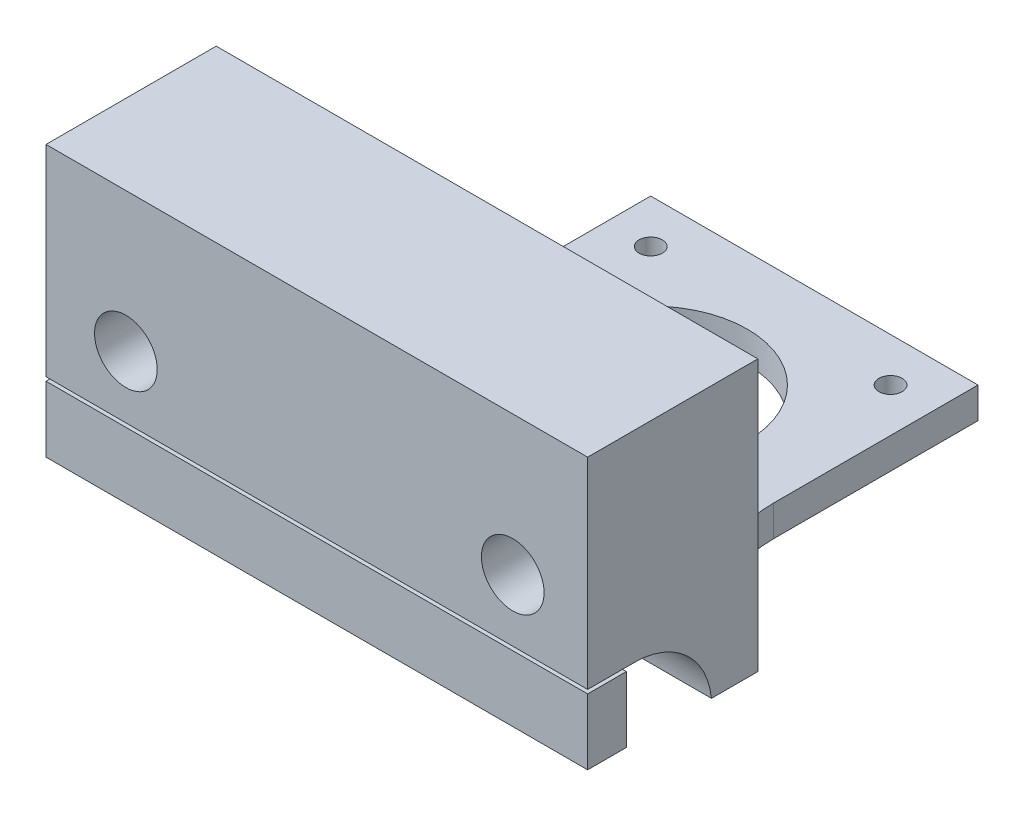
ISO-10303-21;
HEADER;
FILE_DESCRIPTION(('STEP AP214'),'2;1');
FILE_NAME('part.step','',(''),(''),'','','');
FILE_SCHEMA(('AUTOMOTIVE_DESIGN { 1 0 10303 214 1 1 1 1 }'));
ENDSEC;
DATA;
#1=APPLICATION_CONTEXT('core data for automotive mechanical design processes');
#2=APPLICATION_PROTOCOL_DEFINITION('international standard','automotive_design',2000,#1);
#3=PRODUCT_CONTEXT('',#1,'mechanical');
#4=PRODUCT('Part','Part','',(#3));
#5=PRODUCT_RELATED_PRODUCT_CATEGORY('part','',(#4));
#6=PRODUCT_DEFINITION_FORMATION('','',#4);
#7=PRODUCT_DEFINITION_CONTEXT('part definition',#1,'design');
#8=PRODUCT_DEFINITION('design','',#6,#7);
#9=PRODUCT_DEFINITION_SHAPE('','',#8);
#10=(LENGTH_UNIT() NAMED_UNIT(*) SI_UNIT(.MILLI.,.METRE.));
#11=(NAMED_UNIT(*) PLANE_ANGLE_UNIT() SI_UNIT($,.RADIAN.));
#12=(NAMED_UNIT(*) SI_UNIT($,.STERADIAN.) SOLID_ANGLE_UNIT());
#13=UNCERTAINTY_MEASURE_WITH_UNIT(LENGTH_MEASURE(1.E-05),#10,'distance_accuracy_value','');
#14=(GEOMETRIC_REPRESENTATION_CONTEXT(3) GLOBAL_UNCERTAINTY_ASSIGNED_CONTEXT((#13)) GLOBAL_UNIT_ASSIGNED_CONTEXT((#10,
#11,#12)) REPRESENTATION_CONTEXT('',''));
#15=CARTESIAN_POINT('',(0.,0.,0.));
#16=DIRECTION('',(0.,0.,1.));
#17=DIRECTION('',(1.,0.,0.));
#18=AXIS2_PLACEMENT_3D('',#15,#16,#17);
#19=CARTESIAN_POINT('',(-35.,8.5,43.15));
#20=DIRECTION('',(0.,1.,0.));
#21=DIRECTION('',(0.,0.,1.));
#22=AXIS2_PLACEMENT_3D('',#19,#20,#21);
#23=PLANE('',#22);
#24=DIRECTION('',(0.,0.,-1.));
#25=VECTOR('',#24,1.);
#26=CARTESIAN_POINT('',(-35.,8.50000000000001,43.15));
#27=LINE('',#26,#25);
#28=CARTESIAN_POINT('',(-35.,8.50000000000001,43.15));
#29=VERTEX_POINT('',#28);
#30=CARTESIAN_POINT('',(-35.,8.50000000000001,38.15));
#31=VERTEX_POINT('',#30);
#32=EDGE_CURVE('E130',#29,#31,#27,.T.);
#33=ORIENTED_EDGE('',*,*,#32,.F.);
#34=DIRECTION('',(-1.,0.,0.));
#35=VECTOR('',#34,1.);
#36=CARTESIAN_POINT('',(-35.,8.50000000000001,43.15));
#37=LINE('',#36,#35);
#38=CARTESIAN_POINT('',(35.,8.50000000000001,43.15));
#39=VERTEX_POINT('',#38);
#40=EDGE_CURVE('E153',#39,#29,#37,.T.);
#41=ORIENTED_EDGE('',*,*,#40,.F.);
#42=DIRECTION('',(0.,0.,1.));
#43=VECTOR('',#42,1.);
#44=CARTESIAN_POINT('',(35.,8.50000000000001,43.15));
#45=LINE('',#44,#43);
#46=CARTESIAN_POINT('',(35.,8.50000000000001,38.15));
#47=VERTEX_POINT('',#46);
#48=EDGE_CURVE('E158',#47,#39,#45,.T.);
#49=ORIENTED_EDGE('',*,*,#48,.F.);
#50=DIRECTION('',(1.,0.,0.));
#51=VECTOR('',#50,1.);
#52=CARTESIAN_POINT('',(-35.,8.50000000000001,38.15));
#53=LINE('',#52,#51);
#54=EDGE_CURVE('E173',#31,#47,#53,.T.);
#55=ORIENTED_EDGE('',*,*,#54,.F.);
#56=EDGE_LOOP('',(#33,#41,#49,#55));
#57=FACE_BOUND('',#56,.T.);
#58=ADVANCED_FACE('F122',(#57),#23,.T.);
#59=CARTESIAN_POINT('',(0.,0.,0.));
#60=DIRECTION('',(0.,-1.,0.));
#61=DIRECTION('',(0.,0.,-1.));
#62=AXIS2_PLACEMENT_3D('',#59,#60,#61);
#63=PLANE('',#62);
#64=DIRECTION('',(0.,0.,-1.));
#65=VECTOR('',#64,1.);
#66=CARTESIAN_POINT('',(-35.,0.,43.15));
#67=LINE('',#66,#65);
#68=CARTESIAN_POINT('',(-35.,0.,43.15));
#69=VERTEX_POINT('',#68);
#70=CARTESIAN_POINT('',(-35.,0.,38.15));
#71=VERTEX_POINT('',#70);
#72=EDGE_CURVE('E182',#69,#71,#67,.T.);
#73=ORIENTED_EDGE('',*,*,#72,.T.);
#74=DIRECTION('',(1.,0.,0.));
#75=VECTOR('',#74,1.);
#76=CARTESIAN_POINT('',(-35.,0.,38.15));
#77=LINE('',#76,#75);
#78=CARTESIAN_POINT('',(35.,0.,38.15));
#79=VERTEX_POINT('',#78);
#80=EDGE_CURVE('E171',#71,#79,#77,.T.);
#81=ORIENTED_EDGE('',*,*,#80,.T.);
#82=DIRECTION('',(0.,0.,1.));
#83=VECTOR('',#82,1.);
#84=CARTESIAN_POINT('',(35.,0.,43.15));
#85=LINE('',#84,#83);
#86=CARTESIAN_POINT('',(35.,0.,43.15));
#87=VERTEX_POINT('',#86);
#88=EDGE_CURVE('E174',#79,#87,#85,.T.);
#89=ORIENTED_EDGE('',*,*,#88,.T.);
#90=DIRECTION('',(-1.,0.,0.));
#91=VECTOR('',#90,1.);
#92=CARTESIAN_POINT('',(-35.,0.,43.15));
#93=LINE('',#92,#91);
#94=EDGE_CURVE('E179',#87,#69,#93,.T.);
#95=ORIENTED_EDGE('',*,*,#94,.T.);
#96=EDGE_LOOP('',(#73,#81,#89,#95));
#97=FACE_BOUND('',#96,.T.);
#98=ADVANCED_FACE('F181',(#97),#63,.T.);
#99=CARTESIAN_POINT('',(-35.,79.178344238091,38.15));
#100=DIRECTION('',(0.,0.,-1.));
#101=DIRECTION('',(-1.,0.,0.));
#102=AXIS2_PLACEMENT_3D('',#99,#100,#101);
#103=PLANE('',#102);
#104=DIRECTION('',(0.,-1.,0.));
#105=VECTOR('',#104,1.);
#106=CARTESIAN_POINT('',(-35.,79.178344238091,38.15));
#107=LINE('',#106,#105);
#108=EDGE_CURVE('E14',#31,#71,#107,.T.);
#109=ORIENTED_EDGE('',*,*,#108,.F.);
#110=ORIENTED_EDGE('',*,*,#54,.T.);
#111=DIRECTION('',(0.,-1.,0.));
#112=VECTOR('',#111,1.);
#113=CARTESIAN_POINT('',(35.,79.178344238091,38.15));
#114=LINE('',#113,#112);
#115=EDGE_CURVE('E168',#47,#79,#114,.T.);
#116=ORIENTED_EDGE('',*,*,#115,.T.);
#117=ORIENTED_EDGE('',*,*,#80,.F.);
#118=EDGE_LOOP('',(#109,#110,#116,#117));
#119=FACE_BOUND('',#118,.T.);
#120=ADVANCED_FACE('F169',(#119),#103,.T.);
#121=CARTESIAN_POINT('',(35.,79.178344238091,43.15));
#122=DIRECTION('',(1.,0.,0.));
#123=DIRECTION('',(0.,0.,-1.));
#124=AXIS2_PLACEMENT_3D('',#121,#122,#123);
#125=PLANE('',#124);
#126=ORIENTED_EDGE('',*,*,#115,.F.);
#127=ORIENTED_EDGE('',*,*,#48,.T.);
#128=DIRECTION('',(0.,-1.,0.));
#129=VECTOR('',#128,1.);
#130=CARTESIAN_POINT('',(35.,79.178344238091,43.15));
#131=LINE('',#130,#129);
#132=EDGE_CURVE('E163',#39,#87,#131,.T.);
#133=ORIENTED_EDGE('',*,*,#132,.T.);
#134=ORIENTED_EDGE('',*,*,#88,.F.);
#135=EDGE_LOOP('',(#126,#127,#133,#134));
#136=FACE_BOUND('',#135,.T.);
#137=ADVANCED_FACE('F175',(#136),#125,.T.);
#138=CARTESIAN_POINT('',(-35.,79.178344238091,43.15));
#139=DIRECTION('',(0.,0.,1.));
#140=DIRECTION('',(1.,0.,0.));
#141=AXIS2_PLACEMENT_3D('',#138,#139,#140);
#142=PLANE('',#141);
#143=ORIENTED_EDGE('',*,*,#132,.F.);
#144=ORIENTED_EDGE('',*,*,#40,.T.);
#145=DIRECTION('',(0.,-1.,0.));
#146=VECTOR('',#145,1.);
#147=CARTESIAN_POINT('',(-35.,79.178344238091,43.15));
#148=LINE('',#147,#146);
#149=EDGE_CURVE('E189',#29,#69,#148,.T.);
#150=ORIENTED_EDGE('',*,*,#149,.T.);
#151=ORIENTED_EDGE('',*,*,#94,.F.);
#152=EDGE_LOOP('',(#143,#144,#150,#151));
#153=FACE_BOUND('',#152,.T.);
#154=ADVANCED_FACE('F195',(#153),#142,.T.);
#155=CARTESIAN_POINT('',(-35.,79.178344238091,43.15));
#156=DIRECTION('',(-1.,0.,0.));
#157=DIRECTION('',(0.,0.,1.));
#158=AXIS2_PLACEMENT_3D('',#155,#156,#157);
#159=PLANE('',#158);
#160=ORIENTED_EDGE('',*,*,#149,.F.);
#161=ORIENTED_EDGE('',*,*,#32,.T.);
#162=ORIENTED_EDGE('',*,*,#108,.T.);
#163=ORIENTED_EDGE('',*,*,#72,.F.);
#164=EDGE_LOOP('',(#160,#161,#162,#163));
#165=FACE_BOUND('',#164,.T.);
#166=ADVANCED_FACE('F196',(#165),#159,.T.);
#167=CLOSED_SHELL('',(#58,#98,#120,#137,#154,#166));
#168=MANIFOLD_SOLID_BREP('B2',#167);
#169=CARTESIAN_POINT('',(0.,4.,0.));
#170=DIRECTION('',(0.,1.,0.));
#171=DIRECTION('',(0.,0.,1.));
#172=AXIS2_PLACEMENT_3D('',#169,#170,#171);
#173=PLANE('',#172);
#174=CARTESIAN_POINT('',(-15.5,4.,15.5));
#175=DIRECTION('',(0.,1.,0.));
#176=DIRECTION('',(0.,0.,1.));
#177=AXIS2_PLACEMENT_3D('',#174,#175,#176);
#178=CIRCLE('',#177,1.5);
#179=CARTESIAN_POINT('',(-15.5,4.,17.));
#180=VERTEX_POINT('',#179);
#181=EDGE_CURVE('E496',#180,#180,#178,.T.);
#182=ORIENTED_EDGE('',*,*,#181,.F.);
#183=EDGE_LOOP('',(#182));
#184=FACE_BOUND('',#183,.T.);
#185=CARTESIAN_POINT('',(-15.5,4.,-15.5));
#186=DIRECTION('',(0.,1.,0.));
#187=DIRECTION('',(0.,0.,1.));
#188=AXIS2_PLACEMENT_3D('',#185,#186,#187);
#189=CIRCLE('',#188,1.5);
#190=CARTESIAN_POINT('',(-15.5,4.,-14.));
#191=VERTEX_POINT('',#190);
#192=EDGE_CURVE('E508',#191,#191,#189,.T.);
#193=ORIENTED_EDGE('',*,*,#192,.F.);
#194=EDGE_LOOP('',(#193));
#195=FACE_BOUND('',#194,.T.);
#196=CARTESIAN_POINT('',(-37.15,4.,5.29511116406048));
#197=DIRECTION('',(0.,1.,0.));
#198=DIRECTION('',(0.,0.,1.));
#199=AXIS2_PLACEMENT_3D('',#196,#197,#198);
#200=CIRCLE('',#199,16.);
#201=CARTESIAN_POINT('',(-21.15,4.,5.29511116406048));
#202=VERTEX_POINT('',#201);
#203=CARTESIAN_POINT('',(-29.1473719726731,4.,19.15));
#204=VERTEX_POINT('',#203);
#205=EDGE_CURVE('E394',#202,#204,#200,.F.);
#206=ORIENTED_EDGE('',*,*,#205,.T.);
#207=DIRECTION('',(1.,0.,0.));
#208=VECTOR('',#207,1.);
#209=CARTESIAN_POINT('',(0.,4.,19.15));
#210=LINE('',#209,#208);
#211=CARTESIAN_POINT('',(29.1473719726731,4.,19.15));
#212=VERTEX_POINT('',#211);
#213=EDGE_CURVE('E402',#204,#212,#210,.T.);
#214=ORIENTED_EDGE('',*,*,#213,.T.);
#215=CARTESIAN_POINT('',(37.15,4.,5.29511116406048));
#216=DIRECTION('',(0.,1.,0.));
#217=DIRECTION('',(0.,0.,1.));
#218=AXIS2_PLACEMENT_3D('',#215,#216,#217);
#219=CIRCLE('',#218,16.);
#220=CARTESIAN_POINT('',(21.15,4.,5.29511116406048));
#221=VERTEX_POINT('',#220);
#222=EDGE_CURVE('E390',#212,#221,#219,.F.);
#223=ORIENTED_EDGE('',*,*,#222,.T.);
#224=DIRECTION('',(0.,0.,1.));
#225=VECTOR('',#224,1.);
#226=CARTESIAN_POINT('',(21.15,4.,-21.15));
#227=LINE('',#226,#225);
#228=CARTESIAN_POINT('',(21.15,4.,-21.15));
#229=VERTEX_POINT('',#228);
#230=EDGE_CURVE('E458',#229,#221,#227,.T.);
#231=ORIENTED_EDGE('',*,*,#230,.F.);
#232=DIRECTION('',(1.,0.,0.));
#233=VECTOR('',#232,1.);
#234=CARTESIAN_POINT('',(-21.15,4.,-21.15));
#235=LINE('',#234,#233);
#236=CARTESIAN_POINT('',(-21.15,4.,-21.15));
#237=VERTEX_POINT('',#236);
#238=EDGE_CURVE('E465',#237,#229,#235,.T.);
#239=ORIENTED_EDGE('',*,*,#238,.F.);
#240=DIRECTION('',(0.,0.,1.));
#241=VECTOR('',#240,1.);
#242=CARTESIAN_POINT('',(-21.15,4.,-21.15));
#243=LINE('',#242,#241);
#244=EDGE_CURVE('E466',#237,#202,#243,.T.);
#245=ORIENTED_EDGE('',*,*,#244,.T.);
#246=EDGE_LOOP('',(#206,#214,#223,#231,#239,#245));
#247=FACE_BOUND('',#246,.T.);
#248=CARTESIAN_POINT('',(0.,4.,0.));
#249=DIRECTION('',(0.,1.,0.));
#250=DIRECTION('',(0.,0.,1.));
#251=AXIS2_PLACEMENT_3D('',#248,#249,#250);
#252=CIRCLE('',#251,12.5);
#253=CARTESIAN_POINT('',(0.,4.,12.5));
#254=VERTEX_POINT('',#253);
#255=EDGE_CURVE('E514',#254,#254,#252,.T.);
#256=ORIENTED_EDGE('',*,*,#255,.F.);
#257=EDGE_LOOP('',(#256));
#258=FACE_BOUND('',#257,.T.);
#259=CARTESIAN_POINT('',(15.5,4.,15.5));
#260=DIRECTION('',(0.,1.,0.));
#261=DIRECTION('',(0.,0.,1.));
#262=AXIS2_PLACEMENT_3D('',#259,#260,#261);
#263=CIRCLE('',#262,1.5);
#264=CARTESIAN_POINT('',(15.5,4.,17.));
#265=VERTEX_POINT('',#264);
#266=EDGE_CURVE('E502',#265,#265,#263,.T.);
#267=ORIENTED_EDGE('',*,*,#266,.F.);
#268=EDGE_LOOP('',(#267));
#269=FACE_BOUND('',#268,.T.);
#270=CARTESIAN_POINT('',(15.5,4.,-15.5));
#271=DIRECTION('',(0.,1.,0.));
#272=DIRECTION('',(0.,0.,1.));
#273=AXIS2_PLACEMENT_3D('',#270,#271,#272);
#274=CIRCLE('',#273,1.5);
#275=CARTESIAN_POINT('',(15.5,4.,-14.));
#276=VERTEX_POINT('',#275);
#277=EDGE_CURVE('E490',#276,#276,#274,.T.);
#278=ORIENTED_EDGE('',*,*,#277,.F.);
#279=EDGE_LOOP('',(#278));
#280=FACE_BOUND('',#279,.T.);
#281=ADVANCED_FACE('F246',(#184,#195,#247,#258,#269,#280),#173,.T.);
#282=CARTESIAN_POINT('',(0.,0.,0.));
#283=DIRECTION('',(0.,1.,0.));
#284=DIRECTION('',(0.,0.,1.));
#285=AXIS2_PLACEMENT_3D('',#282,#283,#284);
#286=PLANE('',#285);
#287=CARTESIAN_POINT('',(-15.5,0.,15.5));
#288=DIRECTION('',(0.,1.,0.));
#289=DIRECTION('',(0.,0.,1.));
#290=AXIS2_PLACEMENT_3D('',#287,#288,#289);
#291=CIRCLE('',#290,1.5);
#292=CARTESIAN_POINT('',(-15.5,0.,17.));
#293=VERTEX_POINT('',#292);
#294=EDGE_CURVE('E493',#293,#293,#291,.T.);
#295=ORIENTED_EDGE('',*,*,#294,.T.);
#296=EDGE_LOOP('',(#295));
#297=FACE_BOUND('',#296,.T.);
#298=CARTESIAN_POINT('',(-15.5,0.,-15.5));
#299=DIRECTION('',(0.,1.,0.));
#300=DIRECTION('',(0.,0.,1.));
#301=AXIS2_PLACEMENT_3D('',#298,#299,#300);
#302=CIRCLE('',#301,1.5);
#303=CARTESIAN_POINT('',(-15.5,0.,-14.));
#304=VERTEX_POINT('',#303);
#305=EDGE_CURVE('E505',#304,#304,#302,.T.);
#306=ORIENTED_EDGE('',*,*,#305,.T.);
#307=EDGE_LOOP('',(#306));
#308=FACE_BOUND('',#307,.T.);
#309=DIRECTION('',(0.,0.,1.));
#310=VECTOR('',#309,1.);
#311=CARTESIAN_POINT('',(-21.15,0.,-21.15));
#312=LINE('',#311,#310);
#313=CARTESIAN_POINT('',(-21.15,0.,-21.15));
#314=VERTEX_POINT('',#313);
#315=CARTESIAN_POINT('',(-21.15,0.,5.29511116406048));
#316=VERTEX_POINT('',#315);
#317=EDGE_CURVE('E517',#314,#316,#312,.T.);
#318=ORIENTED_EDGE('',*,*,#317,.F.);
#319=DIRECTION('',(1.,0.,0.));
#320=VECTOR('',#319,1.);
#321=CARTESIAN_POINT('',(-21.15,0.,-21.15));
#322=LINE('',#321,#320);
#323=CARTESIAN_POINT('',(21.15,0.,-21.15));
#324=VERTEX_POINT('',#323);
#325=EDGE_CURVE('E521',#314,#324,#322,.T.);
#326=ORIENTED_EDGE('',*,*,#325,.T.);
#327=DIRECTION('',(0.,0.,1.));
#328=VECTOR('',#327,1.);
#329=CARTESIAN_POINT('',(21.15,0.,-21.15));
#330=LINE('',#329,#328);
#331=CARTESIAN_POINT('',(21.15,0.,5.29511116406048));
#332=VERTEX_POINT('',#331);
#333=EDGE_CURVE('E477',#324,#332,#330,.T.);
#334=ORIENTED_EDGE('',*,*,#333,.T.);
#335=CARTESIAN_POINT('',(37.15,0.,5.29511116406048));
#336=DIRECTION('',(0.,1.,0.));
#337=DIRECTION('',(0.,0.,1.));
#338=AXIS2_PLACEMENT_3D('',#335,#336,#337);
#339=CIRCLE('',#338,16.);
#340=CARTESIAN_POINT('',(35.,0.,21.15));
#341=VERTEX_POINT('',#340);
#342=EDGE_CURVE('E388',#332,#341,#339,.T.);
#343=ORIENTED_EDGE('',*,*,#342,.T.);
#344=DIRECTION('',(0.,0.,-1.));
#345=VECTOR('',#344,1.);
#346=CARTESIAN_POINT('',(35.,0.,27.15));
#347=LINE('',#346,#345);
#348=CARTESIAN_POINT('',(35.,0.,27.15));
#349=VERTEX_POINT('',#348);
#350=EDGE_CURVE('E474',#349,#341,#347,.T.);
#351=ORIENTED_EDGE('',*,*,#350,.F.);
#352=DIRECTION('',(1.,0.,0.));
#353=VECTOR('',#352,1.);
#354=CARTESIAN_POINT('',(0.,0.,27.15));
#355=LINE('',#354,#353);
#356=CARTESIAN_POINT('',(-35.,0.,27.15));
#357=VERTEX_POINT('',#356);
#358=EDGE_CURVE('E549',#357,#349,#355,.T.);
#359=ORIENTED_EDGE('',*,*,#358,.F.);
#360=DIRECTION('',(0.,0.,-1.));
#361=VECTOR('',#360,1.);
#362=CARTESIAN_POINT('',(-35.,0.,27.15));
#363=LINE('',#362,#361);
#364=CARTESIAN_POINT('',(-35.,0.,21.15));
#365=VERTEX_POINT('',#364);
#366=EDGE_CURVE('E479',#357,#365,#363,.T.);
#367=ORIENTED_EDGE('',*,*,#366,.T.);
#368=CARTESIAN_POINT('',(-37.15,0.,5.29511116406048));
#369=DIRECTION('',(0.,1.,0.));
#370=DIRECTION('',(0.,0.,1.));
#371=AXIS2_PLACEMENT_3D('',#368,#369,#370);
#372=CIRCLE('',#371,16.);
#373=EDGE_CURVE('E392',#365,#316,#372,.T.);
#374=ORIENTED_EDGE('',*,*,#373,.T.);
#375=EDGE_LOOP('',(#318,#326,#334,#343,#351,#359,#367,#374));
#376=FACE_BOUND('',#375,.T.);
#377=CARTESIAN_POINT('',(0.,0.,0.));
#378=DIRECTION('',(0.,1.,0.));
#379=DIRECTION('',(0.,0.,1.));
#380=AXIS2_PLACEMENT_3D('',#377,#378,#379);
#381=CIRCLE('',#380,12.5);
#382=CARTESIAN_POINT('',(0.,0.,12.5));
#383=VERTEX_POINT('',#382);
#384=EDGE_CURVE('E511',#383,#383,#381,.T.);
#385=ORIENTED_EDGE('',*,*,#384,.T.);
#386=EDGE_LOOP('',(#385));
#387=FACE_BOUND('',#386,.T.);
#388=CARTESIAN_POINT('',(15.5,0.,15.5));
#389=DIRECTION('',(0.,1.,0.));
#390=DIRECTION('',(0.,0.,1.));
#391=AXIS2_PLACEMENT_3D('',#388,#389,#390);
#392=CIRCLE('',#391,1.5);
#393=CARTESIAN_POINT('',(15.5,0.,17.));
#394=VERTEX_POINT('',#393);
#395=EDGE_CURVE('E499',#394,#394,#392,.T.);
#396=ORIENTED_EDGE('',*,*,#395,.T.);
#397=EDGE_LOOP('',(#396));
#398=FACE_BOUND('',#397,.T.);
#399=CARTESIAN_POINT('',(15.5,0.,-15.5));
#400=DIRECTION('',(0.,1.,0.));
#401=DIRECTION('',(0.,0.,1.));
#402=AXIS2_PLACEMENT_3D('',#399,#400,#401);
#403=CIRCLE('',#402,1.5);
#404=CARTESIAN_POINT('',(15.5,0.,-14.));
#405=VERTEX_POINT('',#404);
#406=EDGE_CURVE('E483',#405,#405,#403,.T.);
#407=ORIENTED_EDGE('',*,*,#406,.T.);
#408=EDGE_LOOP('',(#407));
#409=FACE_BOUND('',#408,.T.);
#410=ADVANCED_FACE('F432',(#297,#308,#376,#387,#398,#409),#286,.F.);
#411=CARTESIAN_POINT('',(-21.15,4.,-21.15));
#412=DIRECTION('',(1.,0.,0.));
#413=DIRECTION('',(0.,0.,-1.));
#414=AXIS2_PLACEMENT_3D('',#411,#412,#413);
#415=PLANE('',#414);
#416=ORIENTED_EDGE('',*,*,#317,.T.);
#417=DIRECTION('',(0.,-1.,0.));
#418=VECTOR('',#417,1.);
#419=CARTESIAN_POINT('',(-21.15,4.,5.29511116406048));
#420=LINE('',#419,#418);
#421=EDGE_CURVE('E385',#316,#202,#420,.F.);
#422=ORIENTED_EDGE('',*,*,#421,.T.);
#423=ORIENTED_EDGE('',*,*,#244,.F.);
#424=DIRECTION('',(0.,-1.,0.));
#425=VECTOR('',#424,1.);
#426=CARTESIAN_POINT('',(-21.15,4.,-21.15));
#427=LINE('',#426,#425);
#428=EDGE_CURVE('E524',#237,#314,#427,.T.);
#429=ORIENTED_EDGE('',*,*,#428,.T.);
#430=EDGE_LOOP('',(#416,#422,#423,#429));
#431=FACE_BOUND('',#430,.T.);
#432=ADVANCED_FACE('F419',(#431),#415,.F.);
#433=CARTESIAN_POINT('',(21.15,4.,-21.15));
#434=DIRECTION('',(1.,0.,0.));
#435=DIRECTION('',(0.,0.,-1.));
#436=AXIS2_PLACEMENT_3D('',#433,#434,#435);
#437=PLANE('',#436);
#438=ORIENTED_EDGE('',*,*,#230,.T.);
#439=DIRECTION('',(0.,1.,0.));
#440=VECTOR('',#439,1.);
#441=CARTESIAN_POINT('',(21.15,0.,5.29511116406048));
#442=LINE('',#441,#440);
#443=EDGE_CURVE('E382',#221,#332,#442,.F.);
#444=ORIENTED_EDGE('',*,*,#443,.T.);
#445=ORIENTED_EDGE('',*,*,#333,.F.);
#446=DIRECTION('',(0.,-1.,0.));
#447=VECTOR('',#446,1.);
#448=CARTESIAN_POINT('',(21.15,4.,-21.15));
#449=LINE('',#448,#447);
#450=EDGE_CURVE('E386',#229,#324,#449,.T.);
#451=ORIENTED_EDGE('',*,*,#450,.F.);
#452=EDGE_LOOP('',(#438,#444,#445,#451));
#453=FACE_BOUND('',#452,.T.);
#454=ADVANCED_FACE('F448',(#453),#437,.T.);
#455=CARTESIAN_POINT('',(-21.15,4.,-21.15));
#456=DIRECTION('',(0.,0.,-1.));
#457=DIRECTION('',(-1.,0.,0.));
#458=AXIS2_PLACEMENT_3D('',#455,#456,#457);
#459=PLANE('',#458);
#460=ORIENTED_EDGE('',*,*,#325,.F.);
#461=ORIENTED_EDGE('',*,*,#428,.F.);
#462=ORIENTED_EDGE('',*,*,#238,.T.);
#463=ORIENTED_EDGE('',*,*,#450,.T.);
#464=EDGE_LOOP('',(#460,#461,#462,#463));
#465=FACE_BOUND('',#464,.T.);
#466=ADVANCED_FACE('F446',(#465),#459,.T.);
#467=CARTESIAN_POINT('',(0.,4.,0.));
#468=DIRECTION('',(0.,-1.,0.));
#469=DIRECTION('',(0.,0.,-1.));
#470=AXIS2_PLACEMENT_3D('',#467,#468,#469);
#471=CYLINDRICAL_SURFACE('',#470,12.5);
#472=ORIENTED_EDGE('',*,*,#255,.T.);
#473=EDGE_LOOP('',(#472));
#474=FACE_BOUND('',#473,.T.);
#475=ORIENTED_EDGE('',*,*,#384,.F.);
#476=EDGE_LOOP('',(#475));
#477=FACE_BOUND('',#476,.T.);
#478=ADVANCED_FACE('F443',(#474,#477),#471,.F.);
#479=CARTESIAN_POINT('',(-15.5,4.,-15.5));
#480=DIRECTION('',(0.,-1.,0.));
#481=DIRECTION('',(0.,0.,-1.));
#482=AXIS2_PLACEMENT_3D('',#479,#480,#481);
#483=CYLINDRICAL_SURFACE('',#482,1.5);
#484=ORIENTED_EDGE('',*,*,#192,.T.);
#485=EDGE_LOOP('',(#484));
#486=FACE_BOUND('',#485,.T.);
#487=ORIENTED_EDGE('',*,*,#305,.F.);
#488=EDGE_LOOP('',(#487));
#489=FACE_BOUND('',#488,.T.);
#490=ADVANCED_FACE('F595',(#486,#489),#483,.F.);
#491=CARTESIAN_POINT('',(15.5,4.,15.5));
#492=DIRECTION('',(0.,-1.,0.));
#493=DIRECTION('',(0.,0.,-1.));
#494=AXIS2_PLACEMENT_3D('',#491,#492,#493);
#495=CYLINDRICAL_SURFACE('',#494,1.5);
#496=ORIENTED_EDGE('',*,*,#266,.T.);
#497=EDGE_LOOP('',(#496));
#498=FACE_BOUND('',#497,.T.);
#499=ORIENTED_EDGE('',*,*,#395,.F.);
#500=EDGE_LOOP('',(#499));
#501=FACE_BOUND('',#500,.T.);
#502=ADVANCED_FACE('F592',(#498,#501),#495,.F.);
#503=CARTESIAN_POINT('',(-15.5,4.,15.5));
#504=DIRECTION('',(0.,-1.,0.));
#505=DIRECTION('',(0.,0.,-1.));
#506=AXIS2_PLACEMENT_3D('',#503,#504,#505);
#507=CYLINDRICAL_SURFACE('',#506,1.5);
#508=ORIENTED_EDGE('',*,*,#181,.T.);
#509=EDGE_LOOP('',(#508));
#510=FACE_BOUND('',#509,.T.);
#511=ORIENTED_EDGE('',*,*,#294,.F.);
#512=EDGE_LOOP('',(#511));
#513=FACE_BOUND('',#512,.T.);
#514=ADVANCED_FACE('F588',(#510,#513),#507,.F.);
#515=CARTESIAN_POINT('',(15.5,4.,-15.5));
#516=DIRECTION('',(0.,-1.,0.));
#517=DIRECTION('',(0.,0.,-1.));
#518=AXIS2_PLACEMENT_3D('',#515,#516,#517);
#519=CYLINDRICAL_SURFACE('',#518,1.5);
#520=ORIENTED_EDGE('',*,*,#277,.T.);
#521=EDGE_LOOP('',(#520));
#522=FACE_BOUND('',#521,.T.);
#523=ORIENTED_EDGE('',*,*,#406,.F.);
#524=EDGE_LOOP('',(#523));
#525=FACE_BOUND('',#524,.T.);
#526=ADVANCED_FACE('F585',(#522,#525),#519,.F.);
#527=CARTESIAN_POINT('',(-35.,0.,27.15));
#528=DIRECTION('',(-1.,0.,0.));
#529=DIRECTION('',(0.,-1.,0.));
#530=AXIS2_PLACEMENT_3D('',#527,#528,#529);
#531=PLANE('',#530);
#532=DIRECTION('',(0.,1.,0.));
#533=VECTOR('',#532,1.);
#534=CARTESIAN_POINT('',(-35.,0.,21.15));
#535=LINE('',#534,#533);
#536=CARTESIAN_POINT('',(-35.,6.,21.15));
#537=VERTEX_POINT('',#536);
#538=EDGE_CURVE('E367',#365,#537,#535,.T.);
#539=ORIENTED_EDGE('',*,*,#538,.F.);
#540=ORIENTED_EDGE('',*,*,#366,.F.);
#541=CARTESIAN_POINT('',(-35.,-0.999999999999996,37.0998743710662));
#542=DIRECTION('',(-1.,0.,0.));
#543=DIRECTION('',(0.,-1.,0.));
#544=AXIS2_PLACEMENT_3D('',#541,#542,#543);
#545=CIRCLE('',#544,10.);
#546=CARTESIAN_POINT('',(-35.,9.00000000000001,37.0998743710662));
#547=VERTEX_POINT('',#546);
#548=EDGE_CURVE('E364',#357,#547,#545,.F.);
#549=ORIENTED_EDGE('',*,*,#548,.T.);
#550=DIRECTION('',(0.,0.,-1.));
#551=VECTOR('',#550,1.);
#552=CARTESIAN_POINT('',(-35.,9.00000000000001,43.15));
#553=LINE('',#552,#551);
#554=CARTESIAN_POINT('',(-35.,9.00000000000001,43.15));
#555=VERTEX_POINT('',#554);
#556=EDGE_CURVE('E341',#555,#547,#553,.T.);
#557=ORIENTED_EDGE('',*,*,#556,.F.);
#558=DIRECTION('',(0.,-1.,0.));
#559=VECTOR('',#558,1.);
#560=CARTESIAN_POINT('',(-35.,35.,43.15));
#561=LINE('',#560,#559);
#562=CARTESIAN_POINT('',(-35.,35.,43.15));
#563=VERTEX_POINT('',#562);
#564=EDGE_CURVE('E349',#563,#555,#561,.T.);
#565=ORIENTED_EDGE('',*,*,#564,.F.);
#566=DIRECTION('',(0.,0.,-1.));
#567=VECTOR('',#566,1.);
#568=CARTESIAN_POINT('',(-35.,35.,27.15));
#569=LINE('',#568,#567);
#570=CARTESIAN_POINT('',(-35.,35.,21.15));
#571=VERTEX_POINT('',#570);
#572=EDGE_CURVE('E486',#563,#571,#569,.T.);
#573=ORIENTED_EDGE('',*,*,#572,.T.);
#574=EDGE_CURVE('E365',#537,#571,#535,.T.);
#575=ORIENTED_EDGE('',*,*,#574,.F.);
#576=EDGE_LOOP('',(#539,#540,#549,#557,#565,#573,#575));
#577=FACE_BOUND('',#576,.T.);
#578=ADVANCED_FACE('F362',(#577),#531,.T.);
#579=CARTESIAN_POINT('',(35.,0.,27.15));
#580=DIRECTION('',(-1.,0.,0.));
#581=DIRECTION('',(0.,0.,1.));
#582=AXIS2_PLACEMENT_3D('',#579,#580,#581);
#583=PLANE('',#582);
#584=DIRECTION('',(0.,1.,0.));
#585=VECTOR('',#584,1.);
#586=CARTESIAN_POINT('',(35.,0.,21.15));
#587=LINE('',#586,#585);
#588=CARTESIAN_POINT('',(35.,6.,21.15));
#589=VERTEX_POINT('',#588);
#590=EDGE_CURVE('E266',#341,#589,#587,.T.);
#591=ORIENTED_EDGE('',*,*,#590,.T.);
#592=CARTESIAN_POINT('',(35.,35.,21.15));
#593=VERTEX_POINT('',#592);
#594=EDGE_CURVE('E546',#589,#593,#587,.T.);
#595=ORIENTED_EDGE('',*,*,#594,.T.);
#596=DIRECTION('',(0.,0.,-1.));
#597=VECTOR('',#596,1.);
#598=CARTESIAN_POINT('',(35.,35.,27.15));
#599=LINE('',#598,#597);
#600=CARTESIAN_POINT('',(35.,35.,43.15));
#601=VERTEX_POINT('',#600);
#602=EDGE_CURVE('E480',#601,#593,#599,.T.);
#603=ORIENTED_EDGE('',*,*,#602,.F.);
#604=DIRECTION('',(0.,1.,0.));
#605=VECTOR('',#604,1.);
#606=CARTESIAN_POINT('',(35.,35.,43.15));
#607=LINE('',#606,#605);
#608=CARTESIAN_POINT('',(35.,9.00000000000001,43.15));
#609=VERTEX_POINT('',#608);
#610=EDGE_CURVE('E348',#609,#601,#607,.T.);
#611=ORIENTED_EDGE('',*,*,#610,.F.);
#612=DIRECTION('',(0.,0.,-1.));
#613=VECTOR('',#612,1.);
#614=CARTESIAN_POINT('',(35.,9.00000000000001,43.15));
#615=LINE('',#614,#613);
#616=CARTESIAN_POINT('',(35.,9.00000000000001,37.0998743710662));
#617=VERTEX_POINT('',#616);
#618=EDGE_CURVE('E344',#609,#617,#615,.T.);
#619=ORIENTED_EDGE('',*,*,#618,.T.);
#620=CARTESIAN_POINT('',(35.,-0.999999999999996,37.0998743710662));
#621=DIRECTION('',(-1.,0.,0.));
#622=DIRECTION('',(0.,0.,1.));
#623=AXIS2_PLACEMENT_3D('',#620,#621,#622);
#624=CIRCLE('',#623,10.);
#625=EDGE_CURVE('E399',#617,#349,#624,.T.);
#626=ORIENTED_EDGE('',*,*,#625,.T.);
#627=ORIENTED_EDGE('',*,*,#350,.T.);
#628=EDGE_LOOP('',(#591,#595,#603,#611,#619,#626,#627));
#629=FACE_BOUND('',#628,.T.);
#630=ADVANCED_FACE('F478',(#629),#583,.F.);
#631=CARTESIAN_POINT('',(0.,35.,27.15));
#632=DIRECTION('',(0.,1.,0.));
#633=DIRECTION('',(0.,0.,1.));
#634=AXIS2_PLACEMENT_3D('',#631,#632,#633);
#635=PLANE('',#634);
#636=DIRECTION('',(1.,0.,0.));
#637=VECTOR('',#636,1.);
#638=CARTESIAN_POINT('',(0.,35.,21.15));
#639=LINE('',#638,#637);
#640=EDGE_CURVE('E550',#571,#593,#639,.T.);
#641=ORIENTED_EDGE('',*,*,#640,.F.);
#642=ORIENTED_EDGE('',*,*,#572,.F.);
#643=DIRECTION('',(-1.,0.,0.));
#644=VECTOR('',#643,1.);
#645=CARTESIAN_POINT('',(-35.,35.,43.15));
#646=LINE('',#645,#644);
#647=EDGE_CURVE('E356',#601,#563,#646,.T.);
#648=ORIENTED_EDGE('',*,*,#647,.F.);
#649=ORIENTED_EDGE('',*,*,#602,.T.);
#650=EDGE_LOOP('',(#641,#642,#648,#649));
#651=FACE_BOUND('',#650,.T.);
#652=ADVANCED_FACE('F551',(#651),#635,.T.);
#653=CARTESIAN_POINT('',(0.,0.,21.15));
#654=DIRECTION('',(0.,0.,1.));
#655=DIRECTION('',(1.,0.,0.));
#656=AXIS2_PLACEMENT_3D('',#653,#654,#655);
#657=PLANE('',#656);
#658=CARTESIAN_POINT('',(25.3209634714259,17.,21.15));
#659=DIRECTION('',(0.,0.,1.));
#660=DIRECTION('',(1.,0.,0.));
#661=AXIS2_PLACEMENT_3D('',#658,#659,#660);
#662=CIRCLE('',#661,4.05);
#663=CARTESIAN_POINT('',(29.3709634714259,17.,21.15));
#664=VERTEX_POINT('',#663);
#665=EDGE_CURVE('E379',#664,#664,#662,.T.);
#666=ORIENTED_EDGE('',*,*,#665,.T.);
#667=EDGE_LOOP('',(#666));
#668=FACE_BOUND('',#667,.T.);
#669=CARTESIAN_POINT('',(-24.6790365285741,17.,21.15));
#670=DIRECTION('',(0.,0.,1.));
#671=DIRECTION('',(1.,0.,0.));
#672=AXIS2_PLACEMENT_3D('',#669,#670,#671);
#673=CIRCLE('',#672,4.05);
#674=CARTESIAN_POINT('',(-20.6290365285741,17.,21.15));
#675=VERTEX_POINT('',#674);
#676=EDGE_CURVE('E375',#675,#675,#673,.T.);
#677=ORIENTED_EDGE('',*,*,#676,.T.);
#678=EDGE_LOOP('',(#677));
#679=FACE_BOUND('',#678,.T.);
#680=ORIENTED_EDGE('',*,*,#594,.F.);
#681=DIRECTION('',(1.,0.,0.));
#682=VECTOR('',#681,1.);
#683=CARTESIAN_POINT('',(0.,6.,21.15));
#684=LINE('',#683,#682);
#685=EDGE_CURVE('E405',#589,#537,#684,.F.);
#686=ORIENTED_EDGE('',*,*,#685,.T.);
#687=ORIENTED_EDGE('',*,*,#574,.T.);
#688=ORIENTED_EDGE('',*,*,#640,.T.);
#689=EDGE_LOOP('',(#680,#686,#687,#688));
#690=FACE_BOUND('',#689,.T.);
#691=ADVANCED_FACE('F544',(#668,#679,#690),#657,.F.);
#692=CARTESIAN_POINT('',(0.,0.,43.15));
#693=DIRECTION('',(0.,0.,1.));
#694=DIRECTION('',(1.,0.,0.));
#695=AXIS2_PLACEMENT_3D('',#692,#693,#694);
#696=PLANE('',#695);
#697=CARTESIAN_POINT('',(-24.6790365285741,17.,43.15));
#698=DIRECTION('',(0.,0.,1.));
#699=DIRECTION('',(1.,0.,0.));
#700=AXIS2_PLACEMENT_3D('',#697,#698,#699);
#701=CIRCLE('',#700,4.05);
#702=CARTESIAN_POINT('',(-20.6290365285741,17.,43.15));
#703=VERTEX_POINT('',#702);
#704=EDGE_CURVE('E359',#703,#703,#701,.T.);
#705=ORIENTED_EDGE('',*,*,#704,.F.);
#706=EDGE_LOOP('',(#705));
#707=FACE_BOUND('',#706,.T.);
#708=ORIENTED_EDGE('',*,*,#564,.T.);
#709=DIRECTION('',(1.,0.,0.));
#710=VECTOR('',#709,1.);
#711=CARTESIAN_POINT('',(-35.,9.00000000000001,43.15));
#712=LINE('',#711,#710);
#713=EDGE_CURVE('E336',#555,#609,#712,.T.);
#714=ORIENTED_EDGE('',*,*,#713,.T.);
#715=ORIENTED_EDGE('',*,*,#610,.T.);
#716=ORIENTED_EDGE('',*,*,#647,.T.);
#717=EDGE_LOOP('',(#708,#714,#715,#716));
#718=FACE_BOUND('',#717,.T.);
#719=CARTESIAN_POINT('',(25.3209634714259,17.,43.15));
#720=DIRECTION('',(0.,0.,1.));
#721=DIRECTION('',(1.,0.,0.));
#722=AXIS2_PLACEMENT_3D('',#719,#720,#721);
#723=CIRCLE('',#722,4.05);
#724=CARTESIAN_POINT('',(29.3709634714259,17.,43.15));
#725=VERTEX_POINT('',#724);
#726=EDGE_CURVE('E378',#725,#725,#723,.T.);
#727=ORIENTED_EDGE('',*,*,#726,.F.);
#728=EDGE_LOOP('',(#727));
#729=FACE_BOUND('',#728,.T.);
#730=ADVANCED_FACE('F353',(#707,#718,#729),#696,.T.);
#731=CARTESIAN_POINT('',(-35.,9.00000000000001,43.15));
#732=DIRECTION('',(0.,1.,0.));
#733=DIRECTION('',(0.,0.,1.));
#734=AXIS2_PLACEMENT_3D('',#731,#732,#733);
#735=PLANE('',#734);
#736=ORIENTED_EDGE('',*,*,#556,.T.);
#737=DIRECTION('',(-1.,0.,0.));
#738=VECTOR('',#737,1.);
#739=CARTESIAN_POINT('',(-35.,9.00000000000001,37.0998743710662));
#740=LINE('',#739,#738);
#741=EDGE_CURVE('E397',#547,#617,#740,.F.);
#742=ORIENTED_EDGE('',*,*,#741,.T.);
#743=ORIENTED_EDGE('',*,*,#618,.F.);
#744=ORIENTED_EDGE('',*,*,#713,.F.);
#745=EDGE_LOOP('',(#736,#742,#743,#744));
#746=FACE_BOUND('',#745,.T.);
#747=ADVANCED_FACE('F338',(#746),#735,.F.);
#748=CARTESIAN_POINT('',(-24.6790365285741,17.,43.15));
#749=DIRECTION('',(0.,0.,-1.));
#750=DIRECTION('',(-1.,0.,0.));
#751=AXIS2_PLACEMENT_3D('',#748,#749,#750);
#752=CYLINDRICAL_SURFACE('',#751,4.05);
#753=ORIENTED_EDGE('',*,*,#704,.T.);
#754=EDGE_LOOP('',(#753));
#755=FACE_BOUND('',#754,.T.);
#756=ORIENTED_EDGE('',*,*,#676,.F.);
#757=EDGE_LOOP('',(#756));
#758=FACE_BOUND('',#757,.T.);
#759=ADVANCED_FACE('F571',(#755,#758),#752,.F.);
#760=CARTESIAN_POINT('',(25.3209634714259,17.,43.15));
#761=DIRECTION('',(0.,0.,-1.));
#762=DIRECTION('',(-1.,0.,0.));
#763=AXIS2_PLACEMENT_3D('',#760,#761,#762);
#764=CYLINDRICAL_SURFACE('',#763,4.05);
#765=ORIENTED_EDGE('',*,*,#726,.T.);
#766=EDGE_LOOP('',(#765));
#767=FACE_BOUND('',#766,.T.);
#768=ORIENTED_EDGE('',*,*,#665,.F.);
#769=EDGE_LOOP('',(#768));
#770=FACE_BOUND('',#769,.T.);
#771=ADVANCED_FACE('F417',(#767,#770),#764,.F.);
#772=CARTESIAN_POINT('',(37.15,0.,5.29511116406048));
#773=DIRECTION('',(0.,-1.,0.));
#774=DIRECTION('',(0.,0.,-1.));
#775=AXIS2_PLACEMENT_3D('',#772,#773,#774);
#776=CYLINDRICAL_SURFACE('',#775,16.);
#777=ORIENTED_EDGE('',*,*,#222,.F.);
#778=CARTESIAN_POINT('',(29.1473719726731,4.,19.15));
#779=CARTESIAN_POINT('',(29.2547153999083,4.0000173523689,19.2120054565976));
#780=CARTESIAN_POINT('',(29.3627586342961,4.00288267272583,19.2727444233398));
#781=CARTESIAN_POINT('',(29.5799877171632,4.01374268787837,19.3915720201303));
#782=CARTESIAN_POINT('',(29.6891731034207,4.02173538107547,19.4496616749301));
#783=CARTESIAN_POINT('',(29.908361761581,4.04227025182999,19.5630432851146));
#784=CARTESIAN_POINT('',(30.0183636920118,4.05480611604647,19.6183390021383));
#785=CARTESIAN_POINT('',(30.2391765633426,4.08397785253972,19.7261756024571));
#786=CARTESIAN_POINT('',(30.3499875919766,4.10061417605128,19.7787161817911));
#787=CARTESIAN_POINT('',(30.6850988464534,4.1563508199341,19.9329323592538));
#788=CARTESIAN_POINT('',(30.9104394718621,4.2011138696394,20.0303561086928));
#789=CARTESIAN_POINT('',(31.3628915904491,4.3031700201111,20.2138580970452));
#790=CARTESIAN_POINT('',(31.5900034981795,4.3604661444982,20.2999335901318));
#791=CARTESIAN_POINT('',(32.0200506444613,4.47909106738493,20.4519492600826));
#792=CARTESIAN_POINT('',(32.2228894131102,4.53927793257073,20.5190631642266));
#793=CARTESIAN_POINT('',(32.6287938023133,4.66787532851686,20.6445022902632));
#794=CARTESIAN_POINT('',(32.8318594816757,4.73628920691969,20.7028239125986));
#795=CARTESIAN_POINT('',(33.1354085465213,4.84531237226622,20.7836220939407));
#796=CARTESIAN_POINT('',(33.236211643926,4.88263768701492,20.8093948670873));
#797=CARTESIAN_POINT('',(33.4374202106344,4.95970946381804,20.8587699430038));
#798=CARTESIAN_POINT('',(33.5378257128734,4.99945572066503,20.8823724293104));
#799=CARTESIAN_POINT('',(33.7378502021461,5.0817792888872,20.9273769797075));
#800=CARTESIAN_POINT('',(33.8374698560652,5.12435382441909,20.948781150312));
#801=CARTESIAN_POINT('',(34.0354984946358,5.21318296657892,20.9893799329331));
#802=CARTESIAN_POINT('',(34.1339079044636,5.25943623554416,21.0085753419446));
#803=CARTESIAN_POINT('',(34.2856504709742,5.33584970740678,21.0367305833105));
#804=CARTESIAN_POINT('',(34.3397759383668,5.36414264058471,21.0464795726154));
#805=CARTESIAN_POINT('',(34.4469842108006,5.42306441121652,21.0652304477333));
#806=CARTESIAN_POINT('',(34.5000656622211,5.45369605831574,21.0742314069055));
#807=CARTESIAN_POINT('',(34.601718803242,5.51658953513828,21.0909582510976));
#808=CARTESIAN_POINT('',(34.6503828261638,5.5486907082292,21.0987255892259));
#809=CARTESIAN_POINT('',(34.7446947838616,5.61725410579995,21.1133521007184));
#810=CARTESIAN_POINT('',(34.7903500098504,5.65370513705352,21.1202135132402));
#811=CARTESIAN_POINT('',(34.8509691985315,5.71101955582659,21.129087502667));
#812=CARTESIAN_POINT('',(34.8686043589779,5.72893780559432,21.1316361130853));
#813=CARTESIAN_POINT('',(34.9020398026324,5.76652482799306,21.1364165651886));
#814=CARTESIAN_POINT('',(34.9178384691358,5.78619511647991,21.1386481281484));
#815=CARTESIAN_POINT('',(34.9441014248207,5.82409590144791,21.1423240822308));
#816=CARTESIAN_POINT('',(34.9550159689981,5.84200168676187,21.1438378057541));
#817=CARTESIAN_POINT('',(34.973887126097,5.87928026889544,21.1464399145525));
#818=CARTESIAN_POINT('',(34.9818599375937,5.89864430277807,21.1475306308584));
#819=CARTESIAN_POINT('',(34.9917368050857,5.93174466878503,21.14887780978));
#820=CARTESIAN_POINT('',(34.9947846792347,5.94513020941316,21.1492921325029));
#821=CARTESIAN_POINT('',(34.9989394569923,5.97233055994787,21.1498561968986));
#822=CARTESIAN_POINT('',(35.0000276060102,5.98614824338909,21.1500033821658));
#823=CARTESIAN_POINT('',(35.,6.00000000000001,21.15));
#824=B_SPLINE_CURVE_WITH_KNOTS('',3,(#778,#779,#780,#781,#782,#783,#784,#785,#786,#787,#788,
#789,#790,#791,#792,#793,#794,#795,#796,#797,#798,#799,#800,#801,#802,#803,#804,#805,#806,#807,
#808,#809,#810,#811,#812,#813,#814,#815,#816,#817,#818,#819,#820,#821,#822,#823),.UNSPECIFIED.,
.F.,.F.,(4,2,2,2,2,2,2,2,2,2,2,2,2,2,2,2,2,2,2,2,2,2,4),(0.,0.371813759106193,0.743482459644284,
1.114636645098,1.48583169244039,2.23375921612228,2.98186737769781,3.64745653683389,
4.31331745224,4.64489491687499,4.97644431486123,5.30767298517349,5.63878175982893,
5.8242890131988,6.01002274526823,6.18636851041462,6.36226990289071,6.43799457876146,
6.51378541977118,6.57667732207361,6.63921755223109,6.68028253967761,6.72173847240122),.UNSPECIFIED.);
#825=EDGE_CURVE('E260',#212,#589,#824,.T.);
#826=ORIENTED_EDGE('',*,*,#825,.T.);
#827=ORIENTED_EDGE('',*,*,#590,.F.);
#828=ORIENTED_EDGE('',*,*,#342,.F.);
#829=ORIENTED_EDGE('',*,*,#443,.F.);
#830=EDGE_LOOP('',(#777,#826,#827,#828,#829));
#831=FACE_BOUND('',#830,.T.);
#832=ADVANCED_FACE('F412',(#831),#776,.F.);
#833=CARTESIAN_POINT('',(-37.15,0.,5.29511116406048));
#834=DIRECTION('',(0.,-1.,0.));
#835=DIRECTION('',(1.,0.,0.));
#836=AXIS2_PLACEMENT_3D('',#833,#834,#835);
#837=CYLINDRICAL_SURFACE('',#836,16.);
#838=ORIENTED_EDGE('',*,*,#205,.F.);
#839=ORIENTED_EDGE('',*,*,#421,.F.);
#840=ORIENTED_EDGE('',*,*,#373,.F.);
#841=ORIENTED_EDGE('',*,*,#538,.T.);
#842=CARTESIAN_POINT('',(-35.,6.,21.15));
#843=CARTESIAN_POINT('',(-35.0000655114014,5.98212068584852,21.1500080254479));
#844=CARTESIAN_POINT('',(-34.9982347081474,5.96434294431029,21.1497606817886));
#845=CARTESIAN_POINT('',(-34.9914301478942,5.92971299327732,21.1488361039032));
#846=CARTESIAN_POINT('',(-34.9865108922175,5.91285013372182,21.1481663234163));
#847=CARTESIAN_POINT('',(-34.9720578133592,5.8746215775952,21.1461878493061));
#848=CARTESIAN_POINT('',(-34.9615279536161,5.85365142574431,21.1447399656571));
#849=CARTESIAN_POINT('',(-34.9373703318382,5.81348189152847,21.1413859428681));
#850=CARTESIAN_POINT('',(-34.9237188146353,5.7942977631955,21.1394762829451));
#851=CARTESIAN_POINT('',(-34.8720669225974,5.72938171183493,21.1321683211418));
#852=CARTESIAN_POINT('',(-34.8288238878901,5.68803985422309,21.1259100531288));
#853=CARTESIAN_POINT('',(-34.7375442395286,5.61138930740255,21.1122621318421));
#854=CARTESIAN_POINT('',(-34.689480664001,5.57611793491805,21.1048659755496));
#855=CARTESIAN_POINT('',(-34.5893971768605,5.50843145458181,21.0889690238123));
#856=CARTESIAN_POINT('',(-34.5373019434659,5.47613326663217,21.0804418139448));
#857=CARTESIAN_POINT('',(-34.4316157288725,5.41430200126388,21.0625864312845));
#858=CARTESIAN_POINT('',(-34.3780235242598,5.38477127682445,21.0532575896081));
#859=CARTESIAN_POINT('',(-34.2156515938631,5.29903329919934,21.0241186710638));
#860=CARTESIAN_POINT('',(-34.1054966994644,5.24581728679469,21.0031908347013));
#861=CARTESIAN_POINT('',(-33.8832684109977,5.14418137154529,20.958488496466));
#862=CARTESIAN_POINT('',(-33.7711907379653,5.09577443252363,20.9347066623422));
#863=CARTESIAN_POINT('',(-33.5462772872551,5.00270717916237,20.884416499018));
#864=CARTESIAN_POINT('',(-33.4334426907285,4.95804205463037,20.8579117709255));
#865=CARTESIAN_POINT('',(-33.1724053687556,4.85841090058903,20.7935616305804));
#866=CARTESIAN_POINT('',(-33.0240333727188,4.80451947142629,20.7547405819545));
#867=CARTESIAN_POINT('',(-32.7269929304741,4.70127918967919,20.6723922388581));
#868=CARTESIAN_POINT('',(-32.5783244406958,4.6519310641275,20.6288641935754));
#869=CARTESIAN_POINT('',(-32.2808486436235,4.55759639991363,20.5370149090475));
#870=CARTESIAN_POINT('',(-32.1320414114338,4.51261569217556,20.4886874314979));
#871=CARTESIAN_POINT('',(-31.8347226488783,4.42722545030994,20.38724497606));
#872=CARTESIAN_POINT('',(-31.6862111571885,4.38681647985241,20.3341294092743));
#873=CARTESIAN_POINT('',(-31.3905629460073,4.31112610951639,20.2233951207935));
#874=CARTESIAN_POINT('',(-31.243423192848,4.27581713884717,20.165803417346));
#875=CARTESIAN_POINT('',(-30.949909368389,4.21054964160602,20.0458402731522));
#876=CARTESIAN_POINT('',(-30.8035352559532,4.18059082465588,19.9834690920736));
#877=CARTESIAN_POINT('',(-30.5119989450103,4.12670381187152,19.8540376906268));
#878=CARTESIAN_POINT('',(-30.366835326352,4.10276715486095,19.7869842201733));
#879=CARTESIAN_POINT('',(-30.07783232258,4.06168361452897,19.6481642726043));
#880=CARTESIAN_POINT('',(-29.9339926186418,4.04453505237362,19.5763989659471));
#881=CARTESIAN_POINT('',(-29.6826704784497,4.02123641269638,19.4462194382033));
#882=CARTESIAN_POINT('',(-29.5748324365986,4.01342745613124,19.3887893419505));
#883=CARTESIAN_POINT('',(-29.3602260551999,4.00281539276439,19.2713202766089));
#884=CARTESIAN_POINT('',(-29.2534586698683,4.00001641432228,19.2112791976855));
#885=CARTESIAN_POINT('',(-29.1473719726731,4.,19.15));
#886=B_SPLINE_CURVE_WITH_KNOTS('',3,(#842,#843,#844,#845,#846,#847,#848,#849,#850,#851,#852,
#853,#854,#855,#856,#857,#858,#859,#860,#861,#862,#863,#864,#865,#866,#867,#868,#869,#870,#871,
#872,#873,#874,#875,#876,#877,#878,#879,#880,#881,#882,#883,#884,#885),.UNSPECIFIED.,.F.,.F.,(4,
2,2,2,2,2,2,2,2,2,2,2,2,2,2,2,2,2,2,2,2,4),(0.,0.0533802360333073,0.105843982209652,
0.175971965471274,0.246652498483426,0.425693791248234,0.605799165959465,0.791289133865704,
0.976935406552123,1.34901055336205,1.72206293579351,2.09462814631636,2.58216316019046,
3.06977605572495,3.55803125907659,4.04634659615168,4.53191445186004,5.01745594548487,
5.50231139155319,5.98704684797181,6.35419974668577,6.72165505043601),.UNSPECIFIED.);
#887=EDGE_CURVE('E120',#537,#204,#886,.T.);
#888=ORIENTED_EDGE('',*,*,#887,.T.);
#889=EDGE_LOOP('',(#838,#839,#840,#841,#888));
#890=FACE_BOUND('',#889,.T.);
#891=ADVANCED_FACE('F416',(#890),#837,.F.);
#892=CARTESIAN_POINT('',(0.,-0.999999999999996,37.0998743710662));
#893=DIRECTION('',(-1.,0.,0.));
#894=DIRECTION('',(0.,0.,1.));
#895=AXIS2_PLACEMENT_3D('',#892,#893,#894);
#896=CYLINDRICAL_SURFACE('',#895,10.);
#897=ORIENTED_EDGE('',*,*,#548,.F.);
#898=ORIENTED_EDGE('',*,*,#358,.T.);
#899=ORIENTED_EDGE('',*,*,#625,.F.);
#900=ORIENTED_EDGE('',*,*,#741,.F.);
#901=EDGE_LOOP('',(#897,#898,#899,#900));
#902=FACE_BOUND('',#901,.T.);
#903=ADVANCED_FACE('F423',(#902),#896,.F.);
#904=CARTESIAN_POINT('',(0.,6.,19.15));
#905=DIRECTION('',(1.,0.,0.));
#906=DIRECTION('',(0.,0.,-1.));
#907=AXIS2_PLACEMENT_3D('',#904,#905,#906);
#908=CYLINDRICAL_SURFACE('',#907,2.);
#909=ORIENTED_EDGE('',*,*,#887,.F.);
#910=ORIENTED_EDGE('',*,*,#685,.F.);
#911=ORIENTED_EDGE('',*,*,#825,.F.);
#912=ORIENTED_EDGE('',*,*,#213,.F.);
#913=EDGE_LOOP('',(#909,#910,#911,#912));
#914=FACE_BOUND('',#913,.T.);
#915=ADVANCED_FACE('F248',(#914),#908,.F.);
#916=CLOSED_SHELL('',(#281,#410,#432,#454,#466,#478,#490,#502,#514,#526,#578,#630,#652,#691,
#730,#747,#759,#771,#832,#891,#903,#915));
#917=MANIFOLD_SOLID_BREP('B8',#916);
#918=ADVANCED_BREP_SHAPE_REPRESENTATION('',(#18,#168,#917),#14);
#919=SHAPE_DEFINITION_REPRESENTATION(#9,#918);
ENDSEC;
END-ISO-10303-21;
